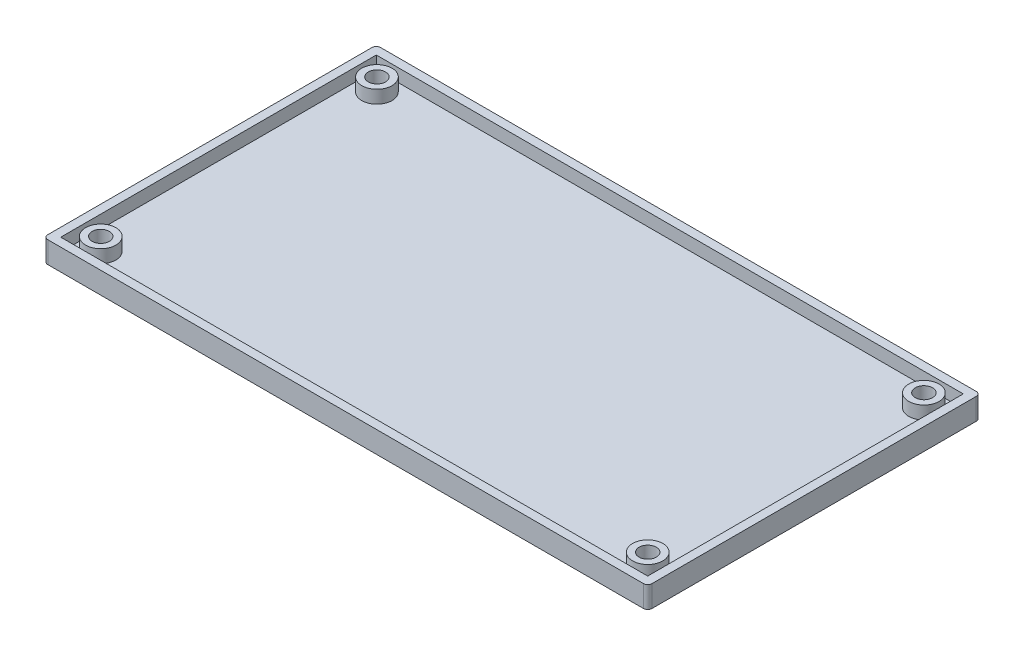
ISO-10303-21;
HEADER;
FILE_DESCRIPTION(('STEP AP214'),'2;1');
FILE_NAME('part.step','',(''),(''),'','','');
FILE_SCHEMA(('AUTOMOTIVE_DESIGN { 1 0 10303 214 1 1 1 1 }'));
ENDSEC;
DATA;
#1=APPLICATION_CONTEXT('core data for automotive mechanical design processes');
#2=APPLICATION_PROTOCOL_DEFINITION('international standard','automotive_design',2000,#1);
#3=PRODUCT_CONTEXT('',#1,'mechanical');
#4=PRODUCT('Part','Part','',(#3));
#5=PRODUCT_RELATED_PRODUCT_CATEGORY('part','',(#4));
#6=PRODUCT_DEFINITION_FORMATION('','',#4);
#7=PRODUCT_DEFINITION_CONTEXT('part definition',#1,'design');
#8=PRODUCT_DEFINITION('design','',#6,#7);
#9=PRODUCT_DEFINITION_SHAPE('','',#8);
#10=(LENGTH_UNIT() NAMED_UNIT(*) SI_UNIT(.MILLI.,.METRE.));
#11=(NAMED_UNIT(*) PLANE_ANGLE_UNIT() SI_UNIT($,.RADIAN.));
#12=(NAMED_UNIT(*) SI_UNIT($,.STERADIAN.) SOLID_ANGLE_UNIT());
#13=UNCERTAINTY_MEASURE_WITH_UNIT(LENGTH_MEASURE(1.E-05),#10,'distance_accuracy_value','');
#14=(GEOMETRIC_REPRESENTATION_CONTEXT(3) GLOBAL_UNCERTAINTY_ASSIGNED_CONTEXT((#13)) GLOBAL_UNIT_ASSIGNED_CONTEXT((#10,
#11,#12)) REPRESENTATION_CONTEXT('',''));
#15=CARTESIAN_POINT('',(0.,0.,0.));
#16=DIRECTION('',(0.,0.,1.));
#17=DIRECTION('',(1.,0.,0.));
#18=AXIS2_PLACEMENT_3D('',#15,#16,#17);
#19=CARTESIAN_POINT('',(0.,2.,0.));
#20=DIRECTION('',(0.,-1.,0.));
#21=DIRECTION('',(0.,0.,-1.));
#22=AXIS2_PLACEMENT_3D('',#19,#20,#21);
#23=PLANE('',#22);
#24=CARTESIAN_POINT('',(130.202184404369,2.,-3.64287528575051));
#25=DIRECTION('',(0.,-1.,0.));
#26=DIRECTION('',(0.,0.,-1.));
#27=AXIS2_PLACEMENT_3D('',#24,#25,#26);
#28=CIRCLE('',#27,3.49999999999999);
#29=CARTESIAN_POINT('',(130.202184404369,2.,-7.1428752857505));
#30=VERTEX_POINT('',#29);
#31=EDGE_CURVE('E254',#30,#30,#28,.F.);
#32=ORIENTED_EDGE('',*,*,#31,.F.);
#33=EDGE_LOOP('',(#32));
#34=FACE_BOUND('',#33,.T.);
#35=CARTESIAN_POINT('',(130.202184404369,2.,-67.6101092202184));
#36=DIRECTION('',(0.,-1.,0.));
#37=DIRECTION('',(0.,0.,-1.));
#38=AXIS2_PLACEMENT_3D('',#35,#36,#37);
#39=CIRCLE('',#38,3.49999999999999);
#40=CARTESIAN_POINT('',(130.202184404369,2.,-71.1101092202184));
#41=VERTEX_POINT('',#40);
#42=EDGE_CURVE('E251',#41,#41,#39,.F.);
#43=ORIENTED_EDGE('',*,*,#42,.F.);
#44=EDGE_LOOP('',(#43));
#45=FACE_BOUND('',#44,.T.);
#46=CARTESIAN_POINT('',(3.51612903225805,2.,-67.6098552197104));
#47=DIRECTION('',(0.,-1.,0.));
#48=DIRECTION('',(0.,0.,-1.));
#49=AXIS2_PLACEMENT_3D('',#46,#47,#48);
#50=CIRCLE('',#49,3.5);
#51=CARTESIAN_POINT('',(3.51612903225805,2.,-71.1098552197104));
#52=VERTEX_POINT('',#51);
#53=EDGE_CURVE('E248',#52,#52,#50,.F.);
#54=ORIENTED_EDGE('',*,*,#53,.F.);
#55=EDGE_LOOP('',(#54));
#56=FACE_BOUND('',#55,.T.);
#57=DIRECTION('',(1.,0.,0.));
#58=VECTOR('',#57,1.);
#59=CARTESIAN_POINT('',(0.,2.,-71.9365252730506));
#60=LINE('',#59,#58);
#61=CARTESIAN_POINT('',(-0.957073914147486,2.,-71.9365252730506));
#62=VERTEX_POINT('',#61);
#63=CARTESIAN_POINT('',(134.997180594361,2.,-71.9365252730506));
#64=VERTEX_POINT('',#63);
#65=EDGE_CURVE('E218',#62,#64,#60,.T.);
#66=ORIENTED_EDGE('',*,*,#65,.F.);
#67=DIRECTION('',(0.,0.,1.));
#68=VECTOR('',#67,1.);
#69=CARTESIAN_POINT('',(-0.957073914147486,2.,0.));
#70=LINE('',#69,#68);
#71=CARTESIAN_POINT('',(-0.957073914147486,2.,1.15161290322578));
#72=VERTEX_POINT('',#71);
#73=EDGE_CURVE('E191',#62,#72,#70,.T.);
#74=ORIENTED_EDGE('',*,*,#73,.T.);
#75=DIRECTION('',(1.,0.,0.));
#76=VECTOR('',#75,1.);
#77=CARTESIAN_POINT('',(0.,2.,1.15161290322578));
#78=LINE('',#77,#76);
#79=CARTESIAN_POINT('',(134.997180594361,2.,1.15161290322578));
#80=VERTEX_POINT('',#79);
#81=EDGE_CURVE('E223',#72,#80,#78,.T.);
#82=ORIENTED_EDGE('',*,*,#81,.T.);
#83=DIRECTION('',(0.,0.,1.));
#84=VECTOR('',#83,1.);
#85=CARTESIAN_POINT('',(134.997180594361,2.,0.));
#86=LINE('',#85,#84);
#87=EDGE_CURVE('E221',#64,#80,#86,.T.);
#88=ORIENTED_EDGE('',*,*,#87,.F.);
#89=EDGE_LOOP('',(#66,#74,#82,#88));
#90=FACE_BOUND('',#89,.T.);
#91=CARTESIAN_POINT('',(3.51612903225805,2.,-3.64287528575051));
#92=DIRECTION('',(0.,-1.,0.));
#93=DIRECTION('',(0.,0.,-1.));
#94=AXIS2_PLACEMENT_3D('',#91,#92,#93);
#95=CIRCLE('',#94,3.5);
#96=CARTESIAN_POINT('',(3.51612903225805,2.,-7.14287528575051));
#97=VERTEX_POINT('',#96);
#98=EDGE_CURVE('E245',#97,#97,#95,.F.);
#99=ORIENTED_EDGE('',*,*,#98,.F.);
#100=EDGE_LOOP('',(#99));
#101=FACE_BOUND('',#100,.T.);
#102=ADVANCED_FACE('F95',(#34,#45,#56,#90,#101),#23,.F.);
#103=CARTESIAN_POINT('',(3.51612903225805,5.,-3.64287528575051));
#104=DIRECTION('',(0.,-1.,0.));
#105=DIRECTION('',(0.,0.,-1.));
#106=AXIS2_PLACEMENT_3D('',#103,#104,#105);
#107=CYLINDRICAL_SURFACE('',#106,3.5);
#108=CARTESIAN_POINT('',(3.51612903225805,5.,-3.64287528575051));
#109=DIRECTION('',(0.,1.,0.));
#110=DIRECTION('',(0.,0.,1.));
#111=AXIS2_PLACEMENT_3D('',#108,#109,#110);
#112=CIRCLE('',#111,3.5);
#113=CARTESIAN_POINT('',(3.51612903225805,5.,-0.142875285750506));
#114=VERTEX_POINT('',#113);
#115=EDGE_CURVE('E195',#114,#114,#112,.T.);
#116=ORIENTED_EDGE('',*,*,#115,.F.);
#117=EDGE_LOOP('',(#116));
#118=FACE_BOUND('',#117,.T.);
#119=ORIENTED_EDGE('',*,*,#98,.T.);
#120=EDGE_LOOP('',(#119));
#121=FACE_BOUND('',#120,.T.);
#122=ADVANCED_FACE('F345',(#118,#121),#107,.T.);
#123=CARTESIAN_POINT('',(0.,5.,0.));
#124=DIRECTION('',(0.,1.,0.));
#125=DIRECTION('',(0.,0.,1.));
#126=AXIS2_PLACEMENT_3D('',#123,#124,#125);
#127=PLANE('',#126);
#128=CARTESIAN_POINT('',(3.51612903225805,5.,-3.64287528575051));
#129=DIRECTION('',(0.,1.,0.));
#130=DIRECTION('',(0.,0.,1.));
#131=AXIS2_PLACEMENT_3D('',#128,#129,#130);
#132=CIRCLE('',#131,2.);
#133=CARTESIAN_POINT('',(3.51612903225805,5.,-1.64287528575051));
#134=VERTEX_POINT('',#133);
#135=EDGE_CURVE('E589',#134,#134,#132,.T.);
#136=ORIENTED_EDGE('',*,*,#135,.F.);
#137=EDGE_LOOP('',(#136));
#138=FACE_BOUND('',#137,.T.);
#139=ORIENTED_EDGE('',*,*,#115,.T.);
#140=EDGE_LOOP('',(#139));
#141=FACE_BOUND('',#140,.T.);
#142=ADVANCED_FACE('F351',(#138,#141),#127,.T.);
#143=CARTESIAN_POINT('',(-0.957073914147486,5.,0.));
#144=DIRECTION('',(1.,0.,0.));
#145=DIRECTION('',(0.,0.,-1.));
#146=AXIS2_PLACEMENT_3D('',#143,#144,#145);
#147=PLANE('',#146);
#148=ORIENTED_EDGE('',*,*,#73,.F.);
#149=DIRECTION('',(0.,-1.,0.));
#150=VECTOR('',#149,1.);
#151=CARTESIAN_POINT('',(-0.957073914147486,5.,-71.9365252730506));
#152=LINE('',#151,#150);
#153=CARTESIAN_POINT('',(-0.957073914147486,5.,-71.9365252730506));
#154=VERTEX_POINT('',#153);
#155=EDGE_CURVE('E184',#154,#62,#152,.T.);
#156=ORIENTED_EDGE('',*,*,#155,.F.);
#157=DIRECTION('',(0.,0.,1.));
#158=VECTOR('',#157,1.);
#159=CARTESIAN_POINT('',(-0.957073914147486,5.,0.));
#160=LINE('',#159,#158);
#161=CARTESIAN_POINT('',(-0.957073914147486,5.,1.15161290322578));
#162=VERTEX_POINT('',#161);
#163=EDGE_CURVE('E188',#154,#162,#160,.T.);
#164=ORIENTED_EDGE('',*,*,#163,.T.);
#165=DIRECTION('',(0.,-1.,0.));
#166=VECTOR('',#165,1.);
#167=CARTESIAN_POINT('',(-0.957073914147486,5.,1.15161290322578));
#168=LINE('',#167,#166);
#169=EDGE_CURVE('E216',#162,#72,#168,.T.);
#170=ORIENTED_EDGE('',*,*,#169,.T.);
#171=EDGE_LOOP('',(#148,#156,#164,#170));
#172=FACE_BOUND('',#171,.T.);
#173=ADVANCED_FACE('F186',(#172),#147,.T.);
#174=CARTESIAN_POINT('',(0.,5.,-71.9365252730506));
#175=DIRECTION('',(0.,0.,-1.));
#176=DIRECTION('',(-1.,0.,0.));
#177=AXIS2_PLACEMENT_3D('',#174,#175,#176);
#178=PLANE('',#177);
#179=ORIENTED_EDGE('',*,*,#65,.T.);
#180=DIRECTION('',(0.,-1.,0.));
#181=VECTOR('',#180,1.);
#182=CARTESIAN_POINT('',(134.997180594361,5.,-71.9365252730506));
#183=LINE('',#182,#181);
#184=CARTESIAN_POINT('',(134.997180594361,5.,-71.9365252730506));
#185=VERTEX_POINT('',#184);
#186=EDGE_CURVE('E196',#185,#64,#183,.T.);
#187=ORIENTED_EDGE('',*,*,#186,.F.);
#188=DIRECTION('',(1.,0.,0.));
#189=VECTOR('',#188,1.);
#190=CARTESIAN_POINT('',(0.,5.,-71.9365252730506));
#191=LINE('',#190,#189);
#192=EDGE_CURVE('E200',#154,#185,#191,.T.);
#193=ORIENTED_EDGE('',*,*,#192,.F.);
#194=ORIENTED_EDGE('',*,*,#155,.T.);
#195=EDGE_LOOP('',(#179,#187,#193,#194));
#196=FACE_BOUND('',#195,.T.);
#197=ADVANCED_FACE('F201',(#196),#178,.F.);
#198=CARTESIAN_POINT('',(134.997180594361,5.,0.));
#199=DIRECTION('',(1.,0.,0.));
#200=DIRECTION('',(0.,0.,-1.));
#201=AXIS2_PLACEMENT_3D('',#198,#199,#200);
#202=PLANE('',#201);
#203=ORIENTED_EDGE('',*,*,#87,.T.);
#204=DIRECTION('',(0.,-1.,0.));
#205=VECTOR('',#204,1.);
#206=CARTESIAN_POINT('',(134.997180594361,5.,1.15161290322578));
#207=LINE('',#206,#205);
#208=CARTESIAN_POINT('',(134.997180594361,5.,1.15161290322578));
#209=VERTEX_POINT('',#208);
#210=EDGE_CURVE('E228',#209,#80,#207,.T.);
#211=ORIENTED_EDGE('',*,*,#210,.F.);
#212=DIRECTION('',(0.,0.,1.));
#213=VECTOR('',#212,1.);
#214=CARTESIAN_POINT('',(134.997180594361,5.,0.));
#215=LINE('',#214,#213);
#216=EDGE_CURVE('E203',#185,#209,#215,.T.);
#217=ORIENTED_EDGE('',*,*,#216,.F.);
#218=ORIENTED_EDGE('',*,*,#186,.T.);
#219=EDGE_LOOP('',(#203,#211,#217,#218));
#220=FACE_BOUND('',#219,.T.);
#221=ADVANCED_FACE('F541',(#220),#202,.F.);
#222=CARTESIAN_POINT('',(0.,5.,1.15161290322578));
#223=DIRECTION('',(0.,0.,-1.));
#224=DIRECTION('',(-1.,0.,0.));
#225=AXIS2_PLACEMENT_3D('',#222,#223,#224);
#226=PLANE('',#225);
#227=ORIENTED_EDGE('',*,*,#81,.F.);
#228=ORIENTED_EDGE('',*,*,#169,.F.);
#229=DIRECTION('',(1.,0.,0.));
#230=VECTOR('',#229,1.);
#231=CARTESIAN_POINT('',(0.,5.,1.15161290322578));
#232=LINE('',#231,#230);
#233=EDGE_CURVE('E207',#162,#209,#232,.T.);
#234=ORIENTED_EDGE('',*,*,#233,.T.);
#235=ORIENTED_EDGE('',*,*,#210,.T.);
#236=EDGE_LOOP('',(#227,#228,#234,#235));
#237=FACE_BOUND('',#236,.T.);
#238=ADVANCED_FACE('F533',(#237),#226,.T.);
#239=CARTESIAN_POINT('',(0.,5.,0.));
#240=DIRECTION('',(0.,1.,0.));
#241=DIRECTION('',(0.,0.,1.));
#242=AXIS2_PLACEMENT_3D('',#239,#240,#241);
#243=PLANE('',#242);
#244=DIRECTION('',(-1.,0.,0.));
#245=VECTOR('',#244,1.);
#246=CARTESIAN_POINT('',(0.,5.,-73.9365252730506));
#247=LINE('',#246,#245);
#248=CARTESIAN_POINT('',(135.997180594361,5.,-73.9365252730506));
#249=VERTEX_POINT('',#248);
#250=CARTESIAN_POINT('',(-1.95707391414749,5.,-73.9365252730506));
#251=VERTEX_POINT('',#250);
#252=EDGE_CURVE('E310',#249,#251,#247,.T.);
#253=ORIENTED_EDGE('',*,*,#252,.T.);
#254=CARTESIAN_POINT('',(-1.95707391414749,5.,-72.9365252730506));
#255=DIRECTION('',(0.,1.,0.));
#256=DIRECTION('',(0.,0.,1.));
#257=AXIS2_PLACEMENT_3D('',#254,#255,#256);
#258=CIRCLE('',#257,1.);
#259=CARTESIAN_POINT('',(-2.95707391414749,5.,-72.9365252730506));
#260=VERTEX_POINT('',#259);
#261=EDGE_CURVE('E285',#251,#260,#258,.T.);
#262=ORIENTED_EDGE('',*,*,#261,.T.);
#263=DIRECTION('',(0.,0.,1.));
#264=VECTOR('',#263,1.);
#265=CARTESIAN_POINT('',(-2.95707391414749,5.,0.));
#266=LINE('',#265,#264);
#267=CARTESIAN_POINT('',(-2.95707391414749,5.,2.15161290322578));
#268=VERTEX_POINT('',#267);
#269=EDGE_CURVE('E210',#260,#268,#266,.T.);
#270=ORIENTED_EDGE('',*,*,#269,.T.);
#271=CARTESIAN_POINT('',(-1.95707391414749,5.,2.15161290322578));
#272=DIRECTION('',(0.,1.,0.));
#273=DIRECTION('',(0.,0.,1.));
#274=AXIS2_PLACEMENT_3D('',#271,#272,#273);
#275=CIRCLE('',#274,1.);
#276=CARTESIAN_POINT('',(-1.95707391414749,5.,3.15161290322578));
#277=VERTEX_POINT('',#276);
#278=EDGE_CURVE('E115',#268,#277,#275,.T.);
#279=ORIENTED_EDGE('',*,*,#278,.T.);
#280=DIRECTION('',(1.,0.,0.));
#281=VECTOR('',#280,1.);
#282=CARTESIAN_POINT('',(0.,5.,3.15161290322578));
#283=LINE('',#282,#281);
#284=CARTESIAN_POINT('',(135.997180594361,5.,3.15161290322578));
#285=VERTEX_POINT('',#284);
#286=EDGE_CURVE('E208',#277,#285,#283,.T.);
#287=ORIENTED_EDGE('',*,*,#286,.T.);
#288=CARTESIAN_POINT('',(135.997180594361,5.,2.15161290322578));
#289=DIRECTION('',(0.,1.,0.));
#290=DIRECTION('',(0.,0.,1.));
#291=AXIS2_PLACEMENT_3D('',#288,#289,#290);
#292=CIRCLE('',#291,1.);
#293=CARTESIAN_POINT('',(136.997180594361,5.,2.15161290322578));
#294=VERTEX_POINT('',#293);
#295=EDGE_CURVE('E281',#285,#294,#292,.T.);
#296=ORIENTED_EDGE('',*,*,#295,.T.);
#297=DIRECTION('',(0.,0.,-1.));
#298=VECTOR('',#297,1.);
#299=CARTESIAN_POINT('',(136.997180594361,5.,0.));
#300=LINE('',#299,#298);
#301=CARTESIAN_POINT('',(136.997180594361,5.,-72.9365252730506));
#302=VERTEX_POINT('',#301);
#303=EDGE_CURVE('E226',#294,#302,#300,.T.);
#304=ORIENTED_EDGE('',*,*,#303,.T.);
#305=CARTESIAN_POINT('',(135.997180594361,5.,-72.9365252730506));
#306=DIRECTION('',(0.,1.,0.));
#307=DIRECTION('',(0.,0.,1.));
#308=AXIS2_PLACEMENT_3D('',#305,#306,#307);
#309=CIRCLE('',#308,1.);
#310=EDGE_CURVE('E283',#302,#249,#309,.T.);
#311=ORIENTED_EDGE('',*,*,#310,.T.);
#312=EDGE_LOOP('',(#253,#262,#270,#279,#287,#296,#304,#311));
#313=FACE_BOUND('',#312,.T.);
#314=ORIENTED_EDGE('',*,*,#163,.F.);
#315=ORIENTED_EDGE('',*,*,#192,.T.);
#316=ORIENTED_EDGE('',*,*,#216,.T.);
#317=ORIENTED_EDGE('',*,*,#233,.F.);
#318=EDGE_LOOP('',(#314,#315,#316,#317));
#319=FACE_BOUND('',#318,.T.);
#320=ADVANCED_FACE('F205',(#313,#319),#243,.T.);
#321=CARTESIAN_POINT('',(0.,0.,0.));
#322=DIRECTION('',(0.,-1.,0.));
#323=DIRECTION('',(0.,0.,-1.));
#324=AXIS2_PLACEMENT_3D('',#321,#322,#323);
#325=PLANE('',#324);
#326=CARTESIAN_POINT('',(3.51612903225805,0.,-3.64287528575051));
#327=DIRECTION('',(0.,-1.,0.));
#328=DIRECTION('',(0.,0.,-1.));
#329=AXIS2_PLACEMENT_3D('',#326,#327,#328);
#330=CIRCLE('',#329,2.);
#331=CARTESIAN_POINT('',(3.51612903225805,0.,-5.64287528575051));
#332=VERTEX_POINT('',#331);
#333=EDGE_CURVE('E258',#332,#332,#330,.T.);
#334=ORIENTED_EDGE('',*,*,#333,.F.);
#335=EDGE_LOOP('',(#334));
#336=FACE_BOUND('',#335,.T.);
#337=CARTESIAN_POINT('',(130.202184404369,0.,-3.64287528575051));
#338=DIRECTION('',(0.,-1.,0.));
#339=DIRECTION('',(0.,0.,-1.));
#340=AXIS2_PLACEMENT_3D('',#337,#338,#339);
#341=CIRCLE('',#340,2.);
#342=CARTESIAN_POINT('',(130.202184404369,0.,-5.6428752857505));
#343=VERTEX_POINT('',#342);
#344=EDGE_CURVE('E605',#343,#343,#341,.T.);
#345=ORIENTED_EDGE('',*,*,#344,.F.);
#346=EDGE_LOOP('',(#345));
#347=FACE_BOUND('',#346,.T.);
#348=CARTESIAN_POINT('',(130.202184404369,0.,-67.6101092202184));
#349=DIRECTION('',(0.,-1.,0.));
#350=DIRECTION('',(0.,0.,-1.));
#351=AXIS2_PLACEMENT_3D('',#348,#349,#350);
#352=CIRCLE('',#351,2.);
#353=CARTESIAN_POINT('',(130.202184404369,0.,-69.6101092202184));
#354=VERTEX_POINT('',#353);
#355=EDGE_CURVE('E608',#354,#354,#352,.T.);
#356=ORIENTED_EDGE('',*,*,#355,.F.);
#357=EDGE_LOOP('',(#356));
#358=FACE_BOUND('',#357,.T.);
#359=CARTESIAN_POINT('',(3.51612903225805,0.,-67.6098552197104));
#360=DIRECTION('',(0.,-1.,0.));
#361=DIRECTION('',(0.,0.,-1.));
#362=AXIS2_PLACEMENT_3D('',#359,#360,#361);
#363=CIRCLE('',#362,2.);
#364=CARTESIAN_POINT('',(3.51612903225805,0.,-69.6098552197104));
#365=VERTEX_POINT('',#364);
#366=EDGE_CURVE('E262',#365,#365,#363,.T.);
#367=ORIENTED_EDGE('',*,*,#366,.F.);
#368=EDGE_LOOP('',(#367));
#369=FACE_BOUND('',#368,.T.);
#370=DIRECTION('',(0.,0.,1.));
#371=VECTOR('',#370,1.);
#372=CARTESIAN_POINT('',(-2.95707391414749,0.,-73.9365252730506));
#373=LINE('',#372,#371);
#374=CARTESIAN_POINT('',(-2.95707391414749,0.,-72.9365252730506));
#375=VERTEX_POINT('',#374);
#376=CARTESIAN_POINT('',(-2.95707391414749,0.,2.15161290322578));
#377=VERTEX_POINT('',#376);
#378=EDGE_CURVE('E237',#375,#377,#373,.T.);
#379=ORIENTED_EDGE('',*,*,#378,.F.);
#380=CARTESIAN_POINT('',(-1.95707391414749,0.,-72.9365252730506));
#381=DIRECTION('',(0.,-1.,0.));
#382=DIRECTION('',(0.,0.,-1.));
#383=AXIS2_PLACEMENT_3D('',#380,#381,#382);
#384=CIRCLE('',#383,1.);
#385=CARTESIAN_POINT('',(-1.95707391414749,0.,-73.9365252730506));
#386=VERTEX_POINT('',#385);
#387=EDGE_CURVE('E273',#375,#386,#384,.T.);
#388=ORIENTED_EDGE('',*,*,#387,.T.);
#389=DIRECTION('',(-1.,0.,0.));
#390=VECTOR('',#389,1.);
#391=CARTESIAN_POINT('',(-2.95707391414749,0.,-73.9365252730506));
#392=LINE('',#391,#390);
#393=CARTESIAN_POINT('',(135.997180594361,0.,-73.9365252730506));
#394=VERTEX_POINT('',#393);
#395=EDGE_CURVE('E234',#394,#386,#392,.T.);
#396=ORIENTED_EDGE('',*,*,#395,.F.);
#397=CARTESIAN_POINT('',(135.997180594361,0.,-72.9365252730506));
#398=DIRECTION('',(0.,-1.,0.));
#399=DIRECTION('',(0.,0.,-1.));
#400=AXIS2_PLACEMENT_3D('',#397,#398,#399);
#401=CIRCLE('',#400,1.);
#402=CARTESIAN_POINT('',(136.997180594361,0.,-72.9365252730506));
#403=VERTEX_POINT('',#402);
#404=EDGE_CURVE('E271',#394,#403,#401,.T.);
#405=ORIENTED_EDGE('',*,*,#404,.T.);
#406=DIRECTION('',(0.,0.,-1.));
#407=VECTOR('',#406,1.);
#408=CARTESIAN_POINT('',(136.997180594361,0.,-73.9365252730506));
#409=LINE('',#408,#407);
#410=CARTESIAN_POINT('',(136.997180594361,0.,2.15161290322578));
#411=VERTEX_POINT('',#410);
#412=EDGE_CURVE('E242',#411,#403,#409,.T.);
#413=ORIENTED_EDGE('',*,*,#412,.F.);
#414=CARTESIAN_POINT('',(135.997180594361,0.,2.15161290322578));
#415=DIRECTION('',(0.,-1.,0.));
#416=DIRECTION('',(0.,0.,-1.));
#417=AXIS2_PLACEMENT_3D('',#414,#415,#416);
#418=CIRCLE('',#417,1.);
#419=CARTESIAN_POINT('',(135.997180594361,0.,3.15161290322578));
#420=VERTEX_POINT('',#419);
#421=EDGE_CURVE('E269',#411,#420,#418,.T.);
#422=ORIENTED_EDGE('',*,*,#421,.T.);
#423=DIRECTION('',(1.,0.,0.));
#424=VECTOR('',#423,1.);
#425=CARTESIAN_POINT('',(-2.95707391414749,0.,3.15161290322578));
#426=LINE('',#425,#424);
#427=CARTESIAN_POINT('',(-1.95707391414749,0.,3.15161290322578));
#428=VERTEX_POINT('',#427);
#429=EDGE_CURVE('E240',#428,#420,#426,.T.);
#430=ORIENTED_EDGE('',*,*,#429,.F.);
#431=CARTESIAN_POINT('',(-1.95707391414749,0.,2.15161290322578));
#432=DIRECTION('',(0.,-1.,0.));
#433=DIRECTION('',(0.,0.,-1.));
#434=AXIS2_PLACEMENT_3D('',#431,#432,#433);
#435=CIRCLE('',#434,1.);
#436=EDGE_CURVE('E267',#428,#377,#435,.T.);
#437=ORIENTED_EDGE('',*,*,#436,.T.);
#438=EDGE_LOOP('',(#379,#388,#396,#405,#413,#422,#430,#437));
#439=FACE_BOUND('',#438,.T.);
#440=ADVANCED_FACE('F298',(#336,#347,#358,#369,#439),#325,.T.);
#441=CARTESIAN_POINT('',(-2.95707391414749,2.,3.15161290322578));
#442=DIRECTION('',(0.,0.,-1.));
#443=DIRECTION('',(-1.,0.,0.));
#444=AXIS2_PLACEMENT_3D('',#441,#442,#443);
#445=PLANE('',#444);
#446=ORIENTED_EDGE('',*,*,#429,.T.);
#447=DIRECTION('',(0.,-1.,0.));
#448=VECTOR('',#447,1.);
#449=CARTESIAN_POINT('',(135.997180594361,2.,3.15161290322578));
#450=LINE('',#449,#448);
#451=EDGE_CURVE('E12',#420,#285,#450,.F.);
#452=ORIENTED_EDGE('',*,*,#451,.T.);
#453=ORIENTED_EDGE('',*,*,#286,.F.);
#454=DIRECTION('',(0.,-1.,0.));
#455=VECTOR('',#454,1.);
#456=CARTESIAN_POINT('',(-1.95707391414749,2.,3.15161290322578));
#457=LINE('',#456,#455);
#458=EDGE_CURVE('E103',#277,#428,#457,.T.);
#459=ORIENTED_EDGE('',*,*,#458,.T.);
#460=EDGE_LOOP('',(#446,#452,#453,#459));
#461=FACE_BOUND('',#460,.T.);
#462=ADVANCED_FACE('F294',(#461),#445,.F.);
#463=CARTESIAN_POINT('',(-2.95707391414749,2.,-73.9365252730506));
#464=DIRECTION('',(1.,0.,0.));
#465=DIRECTION('',(0.,0.,-1.));
#466=AXIS2_PLACEMENT_3D('',#463,#464,#465);
#467=PLANE('',#466);
#468=ORIENTED_EDGE('',*,*,#269,.F.);
#469=DIRECTION('',(0.,-1.,0.));
#470=VECTOR('',#469,1.);
#471=CARTESIAN_POINT('',(-2.95707391414749,2.,-72.9365252730506));
#472=LINE('',#471,#470);
#473=EDGE_CURVE('E264',#260,#375,#472,.T.);
#474=ORIENTED_EDGE('',*,*,#473,.T.);
#475=ORIENTED_EDGE('',*,*,#378,.T.);
#476=DIRECTION('',(0.,-1.,0.));
#477=VECTOR('',#476,1.);
#478=CARTESIAN_POINT('',(-2.95707391414749,2.,2.15161290322578));
#479=LINE('',#478,#477);
#480=EDGE_CURVE('E257',#377,#268,#479,.F.);
#481=ORIENTED_EDGE('',*,*,#480,.T.);
#482=EDGE_LOOP('',(#468,#474,#475,#481));
#483=FACE_BOUND('',#482,.T.);
#484=ADVANCED_FACE('F321',(#483),#467,.F.);
#485=CARTESIAN_POINT('',(-2.95707391414749,2.,-73.9365252730506));
#486=DIRECTION('',(0.,0.,1.));
#487=DIRECTION('',(1.,0.,0.));
#488=AXIS2_PLACEMENT_3D('',#485,#486,#487);
#489=PLANE('',#488);
#490=ORIENTED_EDGE('',*,*,#395,.T.);
#491=DIRECTION('',(0.,-1.,0.));
#492=VECTOR('',#491,1.);
#493=CARTESIAN_POINT('',(-1.95707391414749,2.,-73.9365252730506));
#494=LINE('',#493,#492);
#495=EDGE_CURVE('E278',#386,#251,#494,.F.);
#496=ORIENTED_EDGE('',*,*,#495,.T.);
#497=ORIENTED_EDGE('',*,*,#252,.F.);
#498=DIRECTION('',(0.,-1.,0.));
#499=VECTOR('',#498,1.);
#500=CARTESIAN_POINT('',(135.997180594361,2.,-73.9365252730506));
#501=LINE('',#500,#499);
#502=EDGE_CURVE('E275',#249,#394,#501,.T.);
#503=ORIENTED_EDGE('',*,*,#502,.T.);
#504=EDGE_LOOP('',(#490,#496,#497,#503));
#505=FACE_BOUND('',#504,.T.);
#506=ADVANCED_FACE('F326',(#505),#489,.F.);
#507=CARTESIAN_POINT('',(136.997180594361,2.,-73.9365252730506));
#508=DIRECTION('',(-1.,0.,0.));
#509=DIRECTION('',(0.,0.,1.));
#510=AXIS2_PLACEMENT_3D('',#507,#508,#509);
#511=PLANE('',#510);
#512=ORIENTED_EDGE('',*,*,#412,.T.);
#513=DIRECTION('',(0.,-1.,0.));
#514=VECTOR('',#513,1.);
#515=CARTESIAN_POINT('',(136.997180594361,2.,-72.9365252730506));
#516=LINE('',#515,#514);
#517=EDGE_CURVE('E290',#403,#302,#516,.F.);
#518=ORIENTED_EDGE('',*,*,#517,.T.);
#519=ORIENTED_EDGE('',*,*,#303,.F.);
#520=DIRECTION('',(0.,-1.,0.));
#521=VECTOR('',#520,1.);
#522=CARTESIAN_POINT('',(136.997180594361,2.,2.15161290322578));
#523=LINE('',#522,#521);
#524=EDGE_CURVE('E287',#294,#411,#523,.T.);
#525=ORIENTED_EDGE('',*,*,#524,.T.);
#526=EDGE_LOOP('',(#512,#518,#519,#525));
#527=FACE_BOUND('',#526,.T.);
#528=ADVANCED_FACE('F306',(#527),#511,.F.);
#529=CARTESIAN_POINT('',(3.51612903225805,5.,-67.6098552197104));
#530=DIRECTION('',(0.,-1.,0.));
#531=DIRECTION('',(0.,0.,-1.));
#532=AXIS2_PLACEMENT_3D('',#529,#530,#531);
#533=CYLINDRICAL_SURFACE('',#532,3.5);
#534=CARTESIAN_POINT('',(3.51612903225805,5.,-67.6098552197104));
#535=DIRECTION('',(0.,1.,0.));
#536=DIRECTION('',(0.,0.,1.));
#537=AXIS2_PLACEMENT_3D('',#534,#535,#536);
#538=CIRCLE('',#537,3.5);
#539=CARTESIAN_POINT('',(3.51612903225805,5.,-64.1098552197104));
#540=VERTEX_POINT('',#539);
#541=EDGE_CURVE('E219',#540,#540,#538,.T.);
#542=ORIENTED_EDGE('',*,*,#541,.F.);
#543=EDGE_LOOP('',(#542));
#544=FACE_BOUND('',#543,.T.);
#545=ORIENTED_EDGE('',*,*,#53,.T.);
#546=EDGE_LOOP('',(#545));
#547=FACE_BOUND('',#546,.T.);
#548=ADVANCED_FACE('F363',(#544,#547),#533,.T.);
#549=CARTESIAN_POINT('',(0.,5.,0.));
#550=DIRECTION('',(0.,1.,0.));
#551=DIRECTION('',(0.,0.,1.));
#552=AXIS2_PLACEMENT_3D('',#549,#550,#551);
#553=PLANE('',#552);
#554=CARTESIAN_POINT('',(3.51612903225805,5.,-67.6098552197104));
#555=DIRECTION('',(0.,1.,0.));
#556=DIRECTION('',(0.,0.,1.));
#557=AXIS2_PLACEMENT_3D('',#554,#555,#556);
#558=CIRCLE('',#557,2.);
#559=CARTESIAN_POINT('',(3.51612903225805,5.,-65.6098552197104));
#560=VERTEX_POINT('',#559);
#561=EDGE_CURVE('E602',#560,#560,#558,.T.);
#562=ORIENTED_EDGE('',*,*,#561,.F.);
#563=EDGE_LOOP('',(#562));
#564=FACE_BOUND('',#563,.T.);
#565=ORIENTED_EDGE('',*,*,#541,.T.);
#566=EDGE_LOOP('',(#565));
#567=FACE_BOUND('',#566,.T.);
#568=ADVANCED_FACE('F471',(#564,#567),#553,.T.);
#569=CARTESIAN_POINT('',(130.202184404369,5.,-67.6101092202184));
#570=DIRECTION('',(0.,-1.,0.));
#571=DIRECTION('',(0.,0.,-1.));
#572=AXIS2_PLACEMENT_3D('',#569,#570,#571);
#573=CYLINDRICAL_SURFACE('',#572,3.49999999999999);
#574=CARTESIAN_POINT('',(130.202184404369,5.,-67.6101092202184));
#575=DIRECTION('',(0.,1.,0.));
#576=DIRECTION('',(0.,0.,1.));
#577=AXIS2_PLACEMENT_3D('',#574,#575,#576);
#578=CIRCLE('',#577,3.49999999999999);
#579=CARTESIAN_POINT('',(130.202184404369,5.,-64.1101092202184));
#580=VERTEX_POINT('',#579);
#581=EDGE_CURVE('E614',#580,#580,#578,.T.);
#582=ORIENTED_EDGE('',*,*,#581,.F.);
#583=EDGE_LOOP('',(#582));
#584=FACE_BOUND('',#583,.T.);
#585=ORIENTED_EDGE('',*,*,#42,.T.);
#586=EDGE_LOOP('',(#585));
#587=FACE_BOUND('',#586,.T.);
#588=ADVANCED_FACE('F462',(#584,#587),#573,.T.);
#589=CARTESIAN_POINT('',(0.,5.,0.));
#590=DIRECTION('',(0.,1.,0.));
#591=DIRECTION('',(0.,0.,1.));
#592=AXIS2_PLACEMENT_3D('',#589,#590,#591);
#593=PLANE('',#592);
#594=CARTESIAN_POINT('',(130.202184404369,5.,-67.6101092202184));
#595=DIRECTION('',(0.,1.,0.));
#596=DIRECTION('',(0.,0.,1.));
#597=AXIS2_PLACEMENT_3D('',#594,#595,#596);
#598=CIRCLE('',#597,2.);
#599=CARTESIAN_POINT('',(130.202184404369,5.,-65.6101092202184));
#600=VERTEX_POINT('',#599);
#601=EDGE_CURVE('E598',#600,#600,#598,.T.);
#602=ORIENTED_EDGE('',*,*,#601,.F.);
#603=EDGE_LOOP('',(#602));
#604=FACE_BOUND('',#603,.T.);
#605=ORIENTED_EDGE('',*,*,#581,.T.);
#606=EDGE_LOOP('',(#605));
#607=FACE_BOUND('',#606,.T.);
#608=ADVANCED_FACE('F452',(#604,#607),#593,.T.);
#609=CARTESIAN_POINT('',(130.202184404369,5.,-3.64287528575051));
#610=DIRECTION('',(0.,-1.,0.));
#611=DIRECTION('',(0.,0.,-1.));
#612=AXIS2_PLACEMENT_3D('',#609,#610,#611);
#613=CYLINDRICAL_SURFACE('',#612,3.49999999999999);
#614=CARTESIAN_POINT('',(130.202184404369,5.,-3.64287528575051));
#615=DIRECTION('',(0.,1.,0.));
#616=DIRECTION('',(0.,0.,1.));
#617=AXIS2_PLACEMENT_3D('',#614,#615,#616);
#618=CIRCLE('',#617,3.49999999999999);
#619=CARTESIAN_POINT('',(130.202184404369,5.,-0.142875285750512));
#620=VERTEX_POINT('',#619);
#621=EDGE_CURVE('E261',#620,#620,#618,.T.);
#622=ORIENTED_EDGE('',*,*,#621,.F.);
#623=EDGE_LOOP('',(#622));
#624=FACE_BOUND('',#623,.T.);
#625=ORIENTED_EDGE('',*,*,#31,.T.);
#626=EDGE_LOOP('',(#625));
#627=FACE_BOUND('',#626,.T.);
#628=ADVANCED_FACE('F442',(#624,#627),#613,.T.);
#629=CARTESIAN_POINT('',(0.,5.,0.));
#630=DIRECTION('',(0.,1.,0.));
#631=DIRECTION('',(0.,0.,1.));
#632=AXIS2_PLACEMENT_3D('',#629,#630,#631);
#633=PLANE('',#632);
#634=CARTESIAN_POINT('',(130.202184404369,5.,-3.64287528575051));
#635=DIRECTION('',(0.,1.,0.));
#636=DIRECTION('',(0.,0.,1.));
#637=AXIS2_PLACEMENT_3D('',#634,#635,#636);
#638=CIRCLE('',#637,2.);
#639=CARTESIAN_POINT('',(130.202184404369,5.,-1.64287528575051));
#640=VERTEX_POINT('',#639);
#641=EDGE_CURVE('E595',#640,#640,#638,.T.);
#642=ORIENTED_EDGE('',*,*,#641,.F.);
#643=EDGE_LOOP('',(#642));
#644=FACE_BOUND('',#643,.T.);
#645=ORIENTED_EDGE('',*,*,#621,.T.);
#646=EDGE_LOOP('',(#645));
#647=FACE_BOUND('',#646,.T.);
#648=ADVANCED_FACE('F433',(#644,#647),#633,.T.);
#649=CARTESIAN_POINT('',(130.202184404369,-4.,-3.64287528575051));
#650=DIRECTION('',(0.,1.,0.));
#651=DIRECTION('',(0.,0.,1.));
#652=AXIS2_PLACEMENT_3D('',#649,#650,#651);
#653=CYLINDRICAL_SURFACE('',#652,2.);
#654=ORIENTED_EDGE('',*,*,#344,.T.);
#655=EDGE_LOOP('',(#654));
#656=FACE_BOUND('',#655,.T.);
#657=ORIENTED_EDGE('',*,*,#641,.T.);
#658=EDGE_LOOP('',(#657));
#659=FACE_BOUND('',#658,.T.);
#660=ADVANCED_FACE('F424',(#656,#659),#653,.F.);
#661=CARTESIAN_POINT('',(130.202184404369,-4.,-67.6101092202184));
#662=DIRECTION('',(0.,1.,0.));
#663=DIRECTION('',(0.,0.,1.));
#664=AXIS2_PLACEMENT_3D('',#661,#662,#663);
#665=CYLINDRICAL_SURFACE('',#664,2.);
#666=ORIENTED_EDGE('',*,*,#355,.T.);
#667=EDGE_LOOP('',(#666));
#668=FACE_BOUND('',#667,.T.);
#669=ORIENTED_EDGE('',*,*,#601,.T.);
#670=EDGE_LOOP('',(#669));
#671=FACE_BOUND('',#670,.T.);
#672=ADVANCED_FACE('F415',(#668,#671),#665,.F.);
#673=CARTESIAN_POINT('',(3.51612903225805,-4.,-67.6098552197104));
#674=DIRECTION('',(0.,1.,0.));
#675=DIRECTION('',(0.,0.,1.));
#676=AXIS2_PLACEMENT_3D('',#673,#674,#675);
#677=CYLINDRICAL_SURFACE('',#676,2.);
#678=ORIENTED_EDGE('',*,*,#366,.T.);
#679=EDGE_LOOP('',(#678));
#680=FACE_BOUND('',#679,.T.);
#681=ORIENTED_EDGE('',*,*,#561,.T.);
#682=EDGE_LOOP('',(#681));
#683=FACE_BOUND('',#682,.T.);
#684=ADVANCED_FACE('F340',(#680,#683),#677,.F.);
#685=CARTESIAN_POINT('',(3.51612903225805,-4.,-3.64287528575051));
#686=DIRECTION('',(0.,1.,0.));
#687=DIRECTION('',(0.,0.,1.));
#688=AXIS2_PLACEMENT_3D('',#685,#686,#687);
#689=CYLINDRICAL_SURFACE('',#688,2.);
#690=ORIENTED_EDGE('',*,*,#333,.T.);
#691=EDGE_LOOP('',(#690));
#692=FACE_BOUND('',#691,.T.);
#693=ORIENTED_EDGE('',*,*,#135,.T.);
#694=EDGE_LOOP('',(#693));
#695=FACE_BOUND('',#694,.T.);
#696=ADVANCED_FACE('F332',(#692,#695),#689,.F.);
#697=CARTESIAN_POINT('',(-1.95707391414749,2.,-72.9365252730506));
#698=DIRECTION('',(0.,-1.,0.));
#699=DIRECTION('',(0.,0.,-1.));
#700=AXIS2_PLACEMENT_3D('',#697,#698,#699);
#701=CYLINDRICAL_SURFACE('',#700,1.);
#702=ORIENTED_EDGE('',*,*,#261,.F.);
#703=ORIENTED_EDGE('',*,*,#495,.F.);
#704=ORIENTED_EDGE('',*,*,#387,.F.);
#705=ORIENTED_EDGE('',*,*,#473,.F.);
#706=EDGE_LOOP('',(#702,#703,#704,#705));
#707=FACE_BOUND('',#706,.T.);
#708=ADVANCED_FACE('F329',(#707),#701,.T.);
#709=CARTESIAN_POINT('',(135.997180594361,2.,-72.9365252730506));
#710=DIRECTION('',(0.,-1.,0.));
#711=DIRECTION('',(0.,0.,-1.));
#712=AXIS2_PLACEMENT_3D('',#709,#710,#711);
#713=CYLINDRICAL_SURFACE('',#712,1.);
#714=ORIENTED_EDGE('',*,*,#310,.F.);
#715=ORIENTED_EDGE('',*,*,#517,.F.);
#716=ORIENTED_EDGE('',*,*,#404,.F.);
#717=ORIENTED_EDGE('',*,*,#502,.F.);
#718=EDGE_LOOP('',(#714,#715,#716,#717));
#719=FACE_BOUND('',#718,.T.);
#720=ADVANCED_FACE('F331',(#719),#713,.T.);
#721=CARTESIAN_POINT('',(135.997180594361,2.,2.15161290322578));
#722=DIRECTION('',(0.,-1.,0.));
#723=DIRECTION('',(0.,0.,-1.));
#724=AXIS2_PLACEMENT_3D('',#721,#722,#723);
#725=CYLINDRICAL_SURFACE('',#724,1.);
#726=ORIENTED_EDGE('',*,*,#295,.F.);
#727=ORIENTED_EDGE('',*,*,#451,.F.);
#728=ORIENTED_EDGE('',*,*,#421,.F.);
#729=ORIENTED_EDGE('',*,*,#524,.F.);
#730=EDGE_LOOP('',(#726,#727,#728,#729));
#731=FACE_BOUND('',#730,.T.);
#732=ADVANCED_FACE('F303',(#731),#725,.T.);
#733=CARTESIAN_POINT('',(-1.95707391414749,2.,2.15161290322578));
#734=DIRECTION('',(0.,-1.,0.));
#735=DIRECTION('',(0.,0.,-1.));
#736=AXIS2_PLACEMENT_3D('',#733,#734,#735);
#737=CYLINDRICAL_SURFACE('',#736,1.);
#738=ORIENTED_EDGE('',*,*,#278,.F.);
#739=ORIENTED_EDGE('',*,*,#480,.F.);
#740=ORIENTED_EDGE('',*,*,#436,.F.);
#741=ORIENTED_EDGE('',*,*,#458,.F.);
#742=EDGE_LOOP('',(#738,#739,#740,#741));
#743=FACE_BOUND('',#742,.T.);
#744=ADVANCED_FACE('F97',(#743),#737,.T.);
#745=CLOSED_SHELL('',(#102,#122,#142,#173,#197,#221,#238,#320,#440,#462,#484,#506,#528,#548,
#568,#588,#608,#628,#648,#660,#672,#684,#696,#708,#720,#732,#744));
#746=MANIFOLD_SOLID_BREP('B2',#745);
#747=ADVANCED_BREP_SHAPE_REPRESENTATION('',(#18,#746),#14);
#748=SHAPE_DEFINITION_REPRESENTATION(#9,#747);
ENDSEC;
END-ISO-10303-21;
